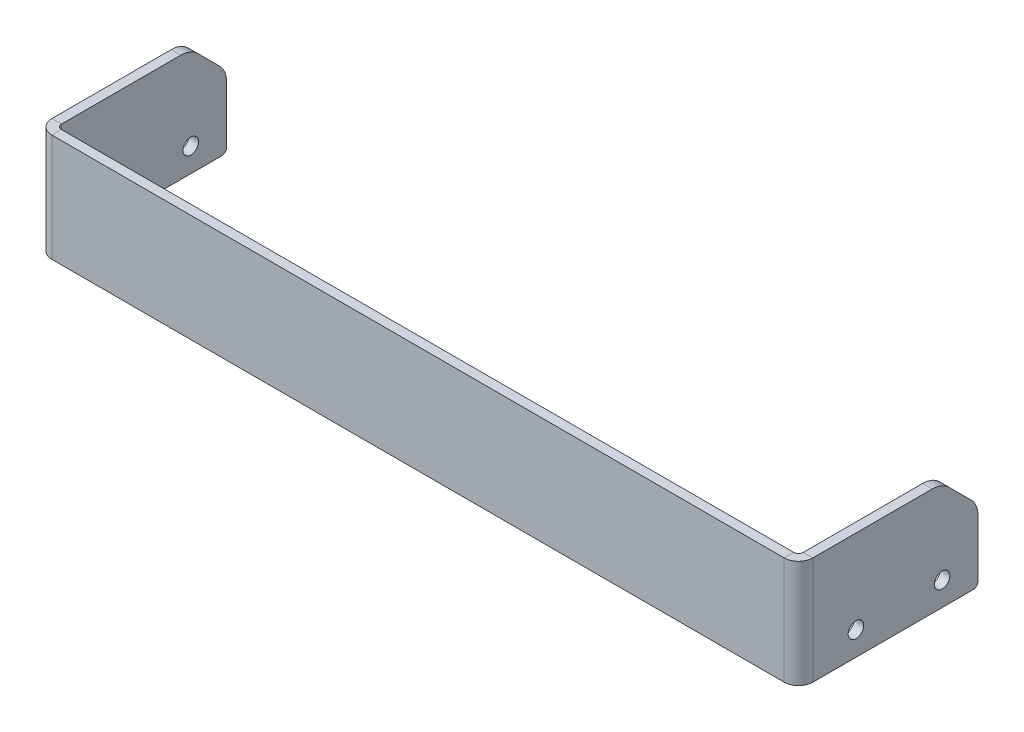
ISO-10303-21;
HEADER;
FILE_DESCRIPTION(('STEP AP214'),'2;1');
FILE_NAME('part.step','',(''),(''),'','','');
FILE_SCHEMA(('AUTOMOTIVE_DESIGN { 1 0 10303 214 1 1 1 1 }'));
ENDSEC;
DATA;
#1=APPLICATION_CONTEXT('core data for automotive mechanical design processes');
#2=APPLICATION_PROTOCOL_DEFINITION('international standard','automotive_design',2000,#1);
#3=PRODUCT_CONTEXT('',#1,'mechanical');
#4=PRODUCT('Part','Part','',(#3));
#5=PRODUCT_RELATED_PRODUCT_CATEGORY('part','',(#4));
#6=PRODUCT_DEFINITION_FORMATION('','',#4);
#7=PRODUCT_DEFINITION_CONTEXT('part definition',#1,'design');
#8=PRODUCT_DEFINITION('design','',#6,#7);
#9=PRODUCT_DEFINITION_SHAPE('','',#8);
#10=(LENGTH_UNIT() NAMED_UNIT(*) SI_UNIT(.MILLI.,.METRE.));
#11=(NAMED_UNIT(*) PLANE_ANGLE_UNIT() SI_UNIT($,.RADIAN.));
#12=(NAMED_UNIT(*) SI_UNIT($,.STERADIAN.) SOLID_ANGLE_UNIT());
#13=UNCERTAINTY_MEASURE_WITH_UNIT(LENGTH_MEASURE(1.E-05),#10,'distance_accuracy_value','');
#14=(GEOMETRIC_REPRESENTATION_CONTEXT(3) GLOBAL_UNCERTAINTY_ASSIGNED_CONTEXT((#13)) GLOBAL_UNIT_ASSIGNED_CONTEXT((#10,
#11,#12)) REPRESENTATION_CONTEXT('',''));
#15=CARTESIAN_POINT('',(0.,0.,0.));
#16=DIRECTION('',(0.,0.,1.));
#17=DIRECTION('',(1.,0.,0.));
#18=AXIS2_PLACEMENT_3D('',#15,#16,#17);
#19=CARTESIAN_POINT('',(-159.,0.,-4.));
#20=DIRECTION('',(0.,1.,0.));
#21=DIRECTION('',(1.,0.,0.));
#22=AXIS2_PLACEMENT_3D('',#19,#20,#21);
#23=PLANE('',#22);
#24=DIRECTION('',(0.,0.,-1.));
#25=VECTOR('',#24,1.);
#26=CARTESIAN_POINT('',(153.,0.,-4.));
#27=LINE('',#26,#25);
#28=CARTESIAN_POINT('',(153.,0.,0.));
#29=VERTEX_POINT('',#28);
#30=CARTESIAN_POINT('',(153.,0.,-4.));
#31=VERTEX_POINT('',#30);
#32=EDGE_CURVE('E177',#29,#31,#27,.T.);
#33=ORIENTED_EDGE('',*,*,#32,.F.);
#34=DIRECTION('',(-1.,0.,0.));
#35=VECTOR('',#34,1.);
#36=CARTESIAN_POINT('',(-159.,0.,0.));
#37=LINE('',#36,#35);
#38=CARTESIAN_POINT('',(-153.,0.,0.));
#39=VERTEX_POINT('',#38);
#40=EDGE_CURVE('E265',#39,#29,#37,.F.);
#41=ORIENTED_EDGE('',*,*,#40,.F.);
#42=DIRECTION('',(0.,0.,-1.));
#43=VECTOR('',#42,1.);
#44=CARTESIAN_POINT('',(-153.,0.,-4.));
#45=LINE('',#44,#43);
#46=CARTESIAN_POINT('',(-153.,0.,-4.));
#47=VERTEX_POINT('',#46);
#48=EDGE_CURVE('E189',#39,#47,#45,.T.);
#49=ORIENTED_EDGE('',*,*,#48,.T.);
#50=DIRECTION('',(1.,0.,0.));
#51=VECTOR('',#50,1.);
#52=CARTESIAN_POINT('',(-159.,0.,-4.));
#53=LINE('',#52,#51);
#54=EDGE_CURVE('E204',#47,#31,#53,.T.);
#55=ORIENTED_EDGE('',*,*,#54,.T.);
#56=EDGE_LOOP('',(#33,#41,#49,#55));
#57=FACE_BOUND('',#56,.T.);
#58=ADVANCED_FACE('F40',(#57),#23,.F.);
#59=CARTESIAN_POINT('',(-153.,0.,-6.00000000000002));
#60=DIRECTION('',(0.,1.,0.));
#61=DIRECTION('',(0.,0.,1.));
#62=AXIS2_PLACEMENT_3D('',#59,#60,#61);
#63=PLANE('',#62);
#64=ORIENTED_EDGE('',*,*,#48,.F.);
#65=CARTESIAN_POINT('',(-153.,0.,-6.00000000000002));
#66=DIRECTION('',(0.,1.,0.));
#67=DIRECTION('',(0.,0.,1.));
#68=AXIS2_PLACEMENT_3D('',#65,#66,#67);
#69=CIRCLE('',#68,6.);
#70=CARTESIAN_POINT('',(-159.,0.,-6.00000000000002));
#71=VERTEX_POINT('',#70);
#72=EDGE_CURVE('E269',#39,#71,#69,.F.);
#73=ORIENTED_EDGE('',*,*,#72,.T.);
#74=DIRECTION('',(1.,0.,0.));
#75=VECTOR('',#74,1.);
#76=CARTESIAN_POINT('',(-155.,0.,-6.00000000000002));
#77=LINE('',#76,#75);
#78=CARTESIAN_POINT('',(-155.,0.,-6.00000000000002));
#79=VERTEX_POINT('',#78);
#80=EDGE_CURVE('E292',#71,#79,#77,.T.);
#81=ORIENTED_EDGE('',*,*,#80,.T.);
#82=CARTESIAN_POINT('',(-153.,0.,-6.00000000000002));
#83=DIRECTION('',(0.,-1.,0.));
#84=DIRECTION('',(0.,0.,-1.));
#85=AXIS2_PLACEMENT_3D('',#82,#83,#84);
#86=CIRCLE('',#85,2.);
#87=EDGE_CURVE('E231',#47,#79,#86,.T.);
#88=ORIENTED_EDGE('',*,*,#87,.F.);
#89=EDGE_LOOP('',(#64,#73,#81,#88));
#90=FACE_BOUND('',#89,.T.);
#91=ADVANCED_FACE('F426',(#90),#63,.F.);
#92=CARTESIAN_POINT('',(-155.,0.,-75.));
#93=DIRECTION('',(0.,-1.,0.));
#94=DIRECTION('',(0.,0.,-1.));
#95=AXIS2_PLACEMENT_3D('',#92,#93,#94);
#96=PLANE('',#95);
#97=DIRECTION('',(0.,0.,-1.));
#98=VECTOR('',#97,1.);
#99=CARTESIAN_POINT('',(-159.,0.,-75.));
#100=LINE('',#99,#98);
#101=CARTESIAN_POINT('',(-159.,0.,-73.));
#102=VERTEX_POINT('',#101);
#103=EDGE_CURVE('E272',#102,#71,#100,.F.);
#104=ORIENTED_EDGE('',*,*,#103,.F.);
#105=DIRECTION('',(-1.,0.,0.));
#106=VECTOR('',#105,1.);
#107=CARTESIAN_POINT('',(-155.,0.,-73.));
#108=LINE('',#107,#106);
#109=CARTESIAN_POINT('',(-155.,0.,-73.));
#110=VERTEX_POINT('',#109);
#111=EDGE_CURVE('E188',#102,#110,#108,.F.);
#112=ORIENTED_EDGE('',*,*,#111,.T.);
#113=DIRECTION('',(0.,0.,-1.));
#114=VECTOR('',#113,1.);
#115=CARTESIAN_POINT('',(-155.,0.,-75.));
#116=LINE('',#115,#114);
#117=EDGE_CURVE('E209',#110,#79,#116,.F.);
#118=ORIENTED_EDGE('',*,*,#117,.T.);
#119=ORIENTED_EDGE('',*,*,#80,.F.);
#120=EDGE_LOOP('',(#104,#112,#118,#119));
#121=FACE_BOUND('',#120,.T.);
#122=ADVANCED_FACE('F432',(#121),#96,.T.);
#123=CARTESIAN_POINT('',(-155.,45.,-75.));
#124=DIRECTION('',(0.,0.,1.));
#125=DIRECTION('',(0.,-1.,0.));
#126=AXIS2_PLACEMENT_3D('',#123,#124,#125);
#127=PLANE('',#126);
#128=DIRECTION('',(0.,1.,0.));
#129=VECTOR('',#128,1.);
#130=CARTESIAN_POINT('',(-159.,45.,-75.));
#131=LINE('',#130,#129);
#132=CARTESIAN_POINT('',(-159.,25.857864376269,-75.));
#133=VERTEX_POINT('',#132);
#134=CARTESIAN_POINT('',(-159.,2.00000000000002,-75.));
#135=VERTEX_POINT('',#134);
#136=EDGE_CURVE('E262',#133,#135,#131,.F.);
#137=ORIENTED_EDGE('',*,*,#136,.F.);
#138=DIRECTION('',(1.,0.,0.));
#139=VECTOR('',#138,1.);
#140=CARTESIAN_POINT('',(-155.,25.857864376269,-75.));
#141=LINE('',#140,#139);
#142=CARTESIAN_POINT('',(-155.,25.857864376269,-75.));
#143=VERTEX_POINT('',#142);
#144=EDGE_CURVE('E335',#133,#143,#141,.T.);
#145=ORIENTED_EDGE('',*,*,#144,.T.);
#146=DIRECTION('',(0.,-1.,0.));
#147=VECTOR('',#146,1.);
#148=CARTESIAN_POINT('',(-155.,45.,-75.));
#149=LINE('',#148,#147);
#150=CARTESIAN_POINT('',(-155.,2.00000000000002,-75.));
#151=VERTEX_POINT('',#150);
#152=EDGE_CURVE('E225',#143,#151,#149,.T.);
#153=ORIENTED_EDGE('',*,*,#152,.T.);
#154=DIRECTION('',(1.,0.,0.));
#155=VECTOR('',#154,1.);
#156=CARTESIAN_POINT('',(-155.,2.,-75.));
#157=LINE('',#156,#155);
#158=EDGE_CURVE('E302',#151,#135,#157,.F.);
#159=ORIENTED_EDGE('',*,*,#158,.T.);
#160=EDGE_LOOP('',(#137,#145,#153,#159));
#161=FACE_BOUND('',#160,.T.);
#162=ADVANCED_FACE('F354',(#161),#127,.F.);
#163=CARTESIAN_POINT('',(-155.,37.5,-67.5));
#164=DIRECTION('',(0.,0.707106781186549,-0.707106781186545));
#165=DIRECTION('',(0.,0.707106781186545,0.707106781186549));
#166=AXIS2_PLACEMENT_3D('',#163,#164,#165);
#167=PLANE('',#166);
#168=DIRECTION('',(0.,0.707106781186545,0.707106781186549));
#169=VECTOR('',#168,1.);
#170=CARTESIAN_POINT('',(-155.,37.5,-67.5));
#171=LINE('',#170,#169);
#172=CARTESIAN_POINT('',(-155.,32.9289321881345,-72.0710678118654));
#173=VERTEX_POINT('',#172);
#174=CARTESIAN_POINT('',(-155.,42.0710678118655,-62.9289321881344));
#175=VERTEX_POINT('',#174);
#176=EDGE_CURVE('E363',#173,#175,#171,.T.);
#177=ORIENTED_EDGE('',*,*,#176,.F.);
#178=DIRECTION('',(-1.,0.,0.));
#179=VECTOR('',#178,1.);
#180=CARTESIAN_POINT('',(-155.,32.9289321881345,-72.0710678118654));
#181=LINE('',#180,#179);
#182=CARTESIAN_POINT('',(-159.,32.9289321881345,-72.0710678118654));
#183=VERTEX_POINT('',#182);
#184=EDGE_CURVE('E345',#173,#183,#181,.T.);
#185=ORIENTED_EDGE('',*,*,#184,.T.);
#186=DIRECTION('',(0.,0.707106781186545,0.707106781186549));
#187=VECTOR('',#186,1.);
#188=CARTESIAN_POINT('',(-159.,37.5,-67.5));
#189=LINE('',#188,#187);
#190=CARTESIAN_POINT('',(-159.,42.0710678118655,-62.9289321881344));
#191=VERTEX_POINT('',#190);
#192=EDGE_CURVE('E273',#183,#191,#189,.T.);
#193=ORIENTED_EDGE('',*,*,#192,.T.);
#194=DIRECTION('',(-1.,0.,0.));
#195=VECTOR('',#194,1.);
#196=CARTESIAN_POINT('',(-155.,42.0710678118655,-62.9289321881344));
#197=LINE('',#196,#195);
#198=EDGE_CURVE('E342',#191,#175,#197,.F.);
#199=ORIENTED_EDGE('',*,*,#198,.T.);
#200=EDGE_LOOP('',(#177,#185,#193,#199));
#201=FACE_BOUND('',#200,.T.);
#202=ADVANCED_FACE('F365',(#201),#167,.T.);
#203=CARTESIAN_POINT('',(-155.,45.,-75.));
#204=DIRECTION('',(0.,-1.,0.));
#205=DIRECTION('',(0.,0.,-1.));
#206=AXIS2_PLACEMENT_3D('',#203,#204,#205);
#207=PLANE('',#206);
#208=DIRECTION('',(0.,0.,-1.));
#209=VECTOR('',#208,1.);
#210=CARTESIAN_POINT('',(-155.,45.,-75.));
#211=LINE('',#210,#209);
#212=CARTESIAN_POINT('',(-155.,45.,-55.857864376269));
#213=VERTEX_POINT('',#212);
#214=CARTESIAN_POINT('',(-155.,45.,-6.00000000000002));
#215=VERTEX_POINT('',#214);
#216=EDGE_CURVE('E367',#213,#215,#211,.F.);
#217=ORIENTED_EDGE('',*,*,#216,.F.);
#218=DIRECTION('',(1.,0.,0.));
#219=VECTOR('',#218,1.);
#220=CARTESIAN_POINT('',(-155.,45.,-55.857864376269));
#221=LINE('',#220,#219);
#222=CARTESIAN_POINT('',(-159.,45.,-55.857864376269));
#223=VERTEX_POINT('',#222);
#224=EDGE_CURVE('E11',#213,#223,#221,.F.);
#225=ORIENTED_EDGE('',*,*,#224,.T.);
#226=DIRECTION('',(0.,0.,-1.));
#227=VECTOR('',#226,1.);
#228=CARTESIAN_POINT('',(-159.,45.,-75.));
#229=LINE('',#228,#227);
#230=CARTESIAN_POINT('',(-159.,45.,-6.00000000000002));
#231=VERTEX_POINT('',#230);
#232=EDGE_CURVE('E270',#223,#231,#229,.F.);
#233=ORIENTED_EDGE('',*,*,#232,.T.);
#234=DIRECTION('',(1.,0.,0.));
#235=VECTOR('',#234,1.);
#236=CARTESIAN_POINT('',(-155.,45.,-6.00000000000002));
#237=LINE('',#236,#235);
#238=EDGE_CURVE('E289',#231,#215,#237,.T.);
#239=ORIENTED_EDGE('',*,*,#238,.T.);
#240=EDGE_LOOP('',(#217,#225,#233,#239));
#241=FACE_BOUND('',#240,.T.);
#242=ADVANCED_FACE('F469',(#241),#207,.F.);
#243=CARTESIAN_POINT('',(-153.,45.,-6.00000000000002));
#244=DIRECTION('',(0.,-1.,0.));
#245=DIRECTION('',(0.,0.,-1.));
#246=AXIS2_PLACEMENT_3D('',#243,#244,#245);
#247=PLANE('',#246);
#248=ORIENTED_EDGE('',*,*,#238,.F.);
#249=CARTESIAN_POINT('',(-153.,45.,-6.00000000000002));
#250=DIRECTION('',(0.,1.,0.));
#251=DIRECTION('',(0.,0.,1.));
#252=AXIS2_PLACEMENT_3D('',#249,#250,#251);
#253=CIRCLE('',#252,6.);
#254=CARTESIAN_POINT('',(-153.,45.,0.));
#255=VERTEX_POINT('',#254);
#256=EDGE_CURVE('E266',#231,#255,#253,.T.);
#257=ORIENTED_EDGE('',*,*,#256,.T.);
#258=DIRECTION('',(0.,0.,-1.));
#259=VECTOR('',#258,1.);
#260=CARTESIAN_POINT('',(-153.,45.,-4.));
#261=LINE('',#260,#259);
#262=CARTESIAN_POINT('',(-153.,45.,-4.));
#263=VERTEX_POINT('',#262);
#264=EDGE_CURVE('E287',#255,#263,#261,.T.);
#265=ORIENTED_EDGE('',*,*,#264,.T.);
#266=CARTESIAN_POINT('',(-153.,45.,-6.00000000000002));
#267=DIRECTION('',(0.,1.,0.));
#268=DIRECTION('',(0.,0.,1.));
#269=AXIS2_PLACEMENT_3D('',#266,#267,#268);
#270=CIRCLE('',#269,2.);
#271=EDGE_CURVE('E201',#215,#263,#270,.T.);
#272=ORIENTED_EDGE('',*,*,#271,.F.);
#273=EDGE_LOOP('',(#248,#257,#265,#272));
#274=FACE_BOUND('',#273,.T.);
#275=ADVANCED_FACE('F466',(#274),#247,.F.);
#276=CARTESIAN_POINT('',(-159.,45.,-4.));
#277=DIRECTION('',(0.,1.,0.));
#278=DIRECTION('',(1.,0.,0.));
#279=AXIS2_PLACEMENT_3D('',#276,#277,#278);
#280=PLANE('',#279);
#281=ORIENTED_EDGE('',*,*,#264,.F.);
#282=DIRECTION('',(-1.,0.,0.));
#283=VECTOR('',#282,1.);
#284=CARTESIAN_POINT('',(-159.,45.,0.));
#285=LINE('',#284,#283);
#286=CARTESIAN_POINT('',(153.,45.,0.));
#287=VERTEX_POINT('',#286);
#288=EDGE_CURVE('E258',#255,#287,#285,.F.);
#289=ORIENTED_EDGE('',*,*,#288,.T.);
#290=DIRECTION('',(0.,0.,-1.));
#291=VECTOR('',#290,1.);
#292=CARTESIAN_POINT('',(153.,45.,-4.));
#293=LINE('',#292,#291);
#294=CARTESIAN_POINT('',(153.,45.,-4.));
#295=VERTEX_POINT('',#294);
#296=EDGE_CURVE('E285',#287,#295,#293,.T.);
#297=ORIENTED_EDGE('',*,*,#296,.T.);
#298=DIRECTION('',(1.,0.,0.));
#299=VECTOR('',#298,1.);
#300=CARTESIAN_POINT('',(-159.,45.,-4.));
#301=LINE('',#300,#299);
#302=EDGE_CURVE('E208',#263,#295,#301,.T.);
#303=ORIENTED_EDGE('',*,*,#302,.F.);
#304=EDGE_LOOP('',(#281,#289,#297,#303));
#305=FACE_BOUND('',#304,.T.);
#306=ADVANCED_FACE('F473',(#305),#280,.T.);
#307=CARTESIAN_POINT('',(153.,45.,-6.));
#308=DIRECTION('',(0.,1.,0.));
#309=DIRECTION('',(0.,0.,1.));
#310=AXIS2_PLACEMENT_3D('',#307,#308,#309);
#311=PLANE('',#310);
#312=ORIENTED_EDGE('',*,*,#296,.F.);
#313=CARTESIAN_POINT('',(153.,45.,-6.));
#314=DIRECTION('',(0.,1.,0.));
#315=DIRECTION('',(0.,0.,1.));
#316=AXIS2_PLACEMENT_3D('',#313,#314,#315);
#317=CIRCLE('',#316,6.);
#318=CARTESIAN_POINT('',(159.,45.,-6.));
#319=VERTEX_POINT('',#318);
#320=EDGE_CURVE('E259',#287,#319,#317,.T.);
#321=ORIENTED_EDGE('',*,*,#320,.T.);
#322=DIRECTION('',(-1.,0.,0.));
#323=VECTOR('',#322,1.);
#324=CARTESIAN_POINT('',(155.,45.,-6.));
#325=LINE('',#324,#323);
#326=CARTESIAN_POINT('',(155.,45.,-6.));
#327=VERTEX_POINT('',#326);
#328=EDGE_CURVE('E283',#319,#327,#325,.T.);
#329=ORIENTED_EDGE('',*,*,#328,.T.);
#330=CARTESIAN_POINT('',(153.,45.,-6.));
#331=DIRECTION('',(0.,-1.,0.));
#332=DIRECTION('',(0.,0.,-1.));
#333=AXIS2_PLACEMENT_3D('',#330,#331,#332);
#334=CIRCLE('',#333,2.);
#335=EDGE_CURVE('E200',#295,#327,#334,.F.);
#336=ORIENTED_EDGE('',*,*,#335,.F.);
#337=EDGE_LOOP('',(#312,#321,#329,#336));
#338=FACE_BOUND('',#337,.T.);
#339=ADVANCED_FACE('F475',(#338),#311,.T.);
#340=CARTESIAN_POINT('',(155.,45.,0.));
#341=DIRECTION('',(0.,1.,0.));
#342=DIRECTION('',(0.,0.,-1.));
#343=AXIS2_PLACEMENT_3D('',#340,#341,#342);
#344=PLANE('',#343);
#345=DIRECTION('',(0.,0.,1.));
#346=VECTOR('',#345,1.);
#347=CARTESIAN_POINT('',(159.,45.,0.));
#348=LINE('',#347,#346);
#349=CARTESIAN_POINT('',(159.,45.,-55.857864376269));
#350=VERTEX_POINT('',#349);
#351=EDGE_CURVE('E255',#319,#350,#348,.F.);
#352=ORIENTED_EDGE('',*,*,#351,.T.);
#353=DIRECTION('',(-1.,0.,0.));
#354=VECTOR('',#353,1.);
#355=CARTESIAN_POINT('',(155.,45.,-55.857864376269));
#356=LINE('',#355,#354);
#357=CARTESIAN_POINT('',(155.,45.,-55.857864376269));
#358=VERTEX_POINT('',#357);
#359=EDGE_CURVE('E332',#350,#358,#356,.T.);
#360=ORIENTED_EDGE('',*,*,#359,.T.);
#361=DIRECTION('',(0.,0.,-1.));
#362=VECTOR('',#361,1.);
#363=CARTESIAN_POINT('',(155.,45.,0.));
#364=LINE('',#363,#362);
#365=EDGE_CURVE('E375',#327,#358,#364,.T.);
#366=ORIENTED_EDGE('',*,*,#365,.F.);
#367=ORIENTED_EDGE('',*,*,#328,.F.);
#368=EDGE_LOOP('',(#352,#360,#366,#367));
#369=FACE_BOUND('',#368,.T.);
#370=ADVANCED_FACE('F404',(#369),#344,.T.);
#371=CARTESIAN_POINT('',(155.,75.,-29.9999999999998));
#372=DIRECTION('',(0.,0.707106781186549,-0.707106781186545));
#373=DIRECTION('',(0.,-0.707106781186545,-0.707106781186549));
#374=AXIS2_PLACEMENT_3D('',#371,#372,#373);
#375=PLANE('',#374);
#376=DIRECTION('',(0.,-0.707106781186545,-0.707106781186549));
#377=VECTOR('',#376,1.);
#378=CARTESIAN_POINT('',(159.,75.,-29.9999999999998));
#379=LINE('',#378,#377);
#380=CARTESIAN_POINT('',(159.,42.0710678118655,-62.9289321881345));
#381=VERTEX_POINT('',#380);
#382=CARTESIAN_POINT('',(159.,32.9289321881346,-72.0710678118654));
#383=VERTEX_POINT('',#382);
#384=EDGE_CURVE('E252',#381,#383,#379,.T.);
#385=ORIENTED_EDGE('',*,*,#384,.T.);
#386=DIRECTION('',(-1.,0.,0.));
#387=VECTOR('',#386,1.);
#388=CARTESIAN_POINT('',(155.,32.9289321881346,-72.0710678118654));
#389=LINE('',#388,#387);
#390=CARTESIAN_POINT('',(155.,32.9289321881346,-72.0710678118654));
#391=VERTEX_POINT('',#390);
#392=EDGE_CURVE('E319',#383,#391,#389,.T.);
#393=ORIENTED_EDGE('',*,*,#392,.T.);
#394=DIRECTION('',(0.,-0.707106781186545,-0.707106781186549));
#395=VECTOR('',#394,1.);
#396=CARTESIAN_POINT('',(155.,75.,-29.9999999999998));
#397=LINE('',#396,#395);
#398=CARTESIAN_POINT('',(155.,42.0710678118655,-62.9289321881345));
#399=VERTEX_POINT('',#398);
#400=EDGE_CURVE('E378',#399,#391,#397,.T.);
#401=ORIENTED_EDGE('',*,*,#400,.F.);
#402=DIRECTION('',(-1.,0.,0.));
#403=VECTOR('',#402,1.);
#404=CARTESIAN_POINT('',(155.,42.0710678118655,-62.9289321881345));
#405=LINE('',#404,#403);
#406=EDGE_CURVE('E317',#399,#381,#405,.F.);
#407=ORIENTED_EDGE('',*,*,#406,.T.);
#408=EDGE_LOOP('',(#385,#393,#401,#407));
#409=FACE_BOUND('',#408,.T.);
#410=ADVANCED_FACE('F412',(#409),#375,.T.);
#411=CARTESIAN_POINT('',(155.,45.,-75.));
#412=DIRECTION('',(0.,0.,-1.));
#413=DIRECTION('',(0.,-1.,0.));
#414=AXIS2_PLACEMENT_3D('',#411,#412,#413);
#415=PLANE('',#414);
#416=DIRECTION('',(0.,-1.,0.));
#417=VECTOR('',#416,1.);
#418=CARTESIAN_POINT('',(155.,45.,-75.));
#419=LINE('',#418,#417);
#420=CARTESIAN_POINT('',(155.,25.8578643762691,-75.));
#421=VERTEX_POINT('',#420);
#422=CARTESIAN_POINT('',(155.,2.00000000000002,-75.));
#423=VERTEX_POINT('',#422);
#424=EDGE_CURVE('E220',#421,#423,#419,.T.);
#425=ORIENTED_EDGE('',*,*,#424,.F.);
#426=DIRECTION('',(-1.,0.,0.));
#427=VECTOR('',#426,1.);
#428=CARTESIAN_POINT('',(155.,25.8578643762691,-75.));
#429=LINE('',#428,#427);
#430=CARTESIAN_POINT('',(159.,25.8578643762691,-75.));
#431=VERTEX_POINT('',#430);
#432=EDGE_CURVE('E326',#421,#431,#429,.F.);
#433=ORIENTED_EDGE('',*,*,#432,.T.);
#434=DIRECTION('',(0.,1.,0.));
#435=VECTOR('',#434,1.);
#436=CARTESIAN_POINT('',(159.,45.,-75.));
#437=LINE('',#436,#435);
#438=CARTESIAN_POINT('',(159.,2.00000000000002,-75.));
#439=VERTEX_POINT('',#438);
#440=EDGE_CURVE('E250',#431,#439,#437,.F.);
#441=ORIENTED_EDGE('',*,*,#440,.T.);
#442=DIRECTION('',(1.,0.,0.));
#443=VECTOR('',#442,1.);
#444=CARTESIAN_POINT('',(155.,2.,-75.));
#445=LINE('',#444,#443);
#446=EDGE_CURVE('E307',#439,#423,#445,.F.);
#447=ORIENTED_EDGE('',*,*,#446,.T.);
#448=EDGE_LOOP('',(#425,#433,#441,#447));
#449=FACE_BOUND('',#448,.T.);
#450=ADVANCED_FACE('F391',(#449),#415,.T.);
#451=CARTESIAN_POINT('',(155.,0.,0.));
#452=DIRECTION('',(0.,1.,0.));
#453=DIRECTION('',(0.,0.,-1.));
#454=AXIS2_PLACEMENT_3D('',#451,#452,#453);
#455=PLANE('',#454);
#456=DIRECTION('',(0.,0.,-1.));
#457=VECTOR('',#456,1.);
#458=CARTESIAN_POINT('',(155.,0.,0.));
#459=LINE('',#458,#457);
#460=CARTESIAN_POINT('',(155.,0.,-6.));
#461=VERTEX_POINT('',#460);
#462=CARTESIAN_POINT('',(155.,0.,-73.));
#463=VERTEX_POINT('',#462);
#464=EDGE_CURVE('E215',#461,#463,#459,.T.);
#465=ORIENTED_EDGE('',*,*,#464,.T.);
#466=DIRECTION('',(-1.,0.,0.));
#467=VECTOR('',#466,1.);
#468=CARTESIAN_POINT('',(155.,0.,-73.));
#469=LINE('',#468,#467);
#470=CARTESIAN_POINT('',(159.,0.,-73.));
#471=VERTEX_POINT('',#470);
#472=EDGE_CURVE('E312',#463,#471,#469,.F.);
#473=ORIENTED_EDGE('',*,*,#472,.T.);
#474=DIRECTION('',(0.,0.,1.));
#475=VECTOR('',#474,1.);
#476=CARTESIAN_POINT('',(159.,0.,0.));
#477=LINE('',#476,#475);
#478=CARTESIAN_POINT('',(159.,0.,-6.));
#479=VERTEX_POINT('',#478);
#480=EDGE_CURVE('E243',#479,#471,#477,.F.);
#481=ORIENTED_EDGE('',*,*,#480,.F.);
#482=DIRECTION('',(-1.,0.,0.));
#483=VECTOR('',#482,1.);
#484=CARTESIAN_POINT('',(155.,0.,-6.));
#485=LINE('',#484,#483);
#486=EDGE_CURVE('E230',#479,#461,#485,.T.);
#487=ORIENTED_EDGE('',*,*,#486,.T.);
#488=EDGE_LOOP('',(#465,#473,#481,#487));
#489=FACE_BOUND('',#488,.T.);
#490=ADVANCED_FACE('F400',(#489),#455,.F.);
#491=CARTESIAN_POINT('',(153.,0.,-6.));
#492=DIRECTION('',(0.,-1.,0.));
#493=DIRECTION('',(0.,0.,-1.));
#494=AXIS2_PLACEMENT_3D('',#491,#492,#493);
#495=PLANE('',#494);
#496=CARTESIAN_POINT('',(153.,0.,-6.));
#497=DIRECTION('',(0.,1.,0.));
#498=DIRECTION('',(0.,0.,1.));
#499=AXIS2_PLACEMENT_3D('',#496,#497,#498);
#500=CIRCLE('',#499,6.);
#501=EDGE_CURVE('E183',#479,#29,#500,.F.);
#502=ORIENTED_EDGE('',*,*,#501,.T.);
#503=ORIENTED_EDGE('',*,*,#32,.T.);
#504=CARTESIAN_POINT('',(153.,0.,-6.));
#505=DIRECTION('',(0.,1.,0.));
#506=DIRECTION('',(0.,0.,1.));
#507=AXIS2_PLACEMENT_3D('',#504,#505,#506);
#508=CIRCLE('',#507,2.);
#509=EDGE_CURVE('E180',#461,#31,#508,.F.);
#510=ORIENTED_EDGE('',*,*,#509,.F.);
#511=ORIENTED_EDGE('',*,*,#486,.F.);
#512=EDGE_LOOP('',(#502,#503,#510,#511));
#513=FACE_BOUND('',#512,.T.);
#514=ADVANCED_FACE('F179',(#513),#495,.T.);
#515=CARTESIAN_POINT('',(155.,45.,0.));
#516=DIRECTION('',(-1.,0.,0.));
#517=DIRECTION('',(0.,0.,1.));
#518=AXIS2_PLACEMENT_3D('',#515,#516,#517);
#519=PLANE('',#518);
#520=CARTESIAN_POINT('',(155.,10.,-60.));
#521=DIRECTION('',(-1.,0.,0.));
#522=DIRECTION('',(0.,0.,1.));
#523=AXIS2_PLACEMENT_3D('',#520,#521,#522);
#524=CIRCLE('',#523,3.24999999999994);
#525=CARTESIAN_POINT('',(155.,10.,-56.7500000000001));
#526=VERTEX_POINT('',#525);
#527=EDGE_CURVE('E813',#526,#526,#524,.T.);
#528=ORIENTED_EDGE('',*,*,#527,.F.);
#529=EDGE_LOOP('',(#528));
#530=FACE_BOUND('',#529,.T.);
#531=CARTESIAN_POINT('',(155.,10.,-24.));
#532=DIRECTION('',(-1.,0.,0.));
#533=DIRECTION('',(0.,0.,1.));
#534=AXIS2_PLACEMENT_3D('',#531,#532,#533);
#535=CIRCLE('',#534,3.24999999999994);
#536=CARTESIAN_POINT('',(155.,10.,-20.7500000000001));
#537=VERTEX_POINT('',#536);
#538=EDGE_CURVE('E279',#537,#537,#535,.T.);
#539=ORIENTED_EDGE('',*,*,#538,.F.);
#540=EDGE_LOOP('',(#539));
#541=FACE_BOUND('',#540,.T.);
#542=ORIENTED_EDGE('',*,*,#400,.T.);
#543=CARTESIAN_POINT('',(155.,25.8578643762691,-65.));
#544=DIRECTION('',(-1.,0.,0.));
#545=DIRECTION('',(0.,0.,1.));
#546=AXIS2_PLACEMENT_3D('',#543,#544,#545);
#547=CIRCLE('',#546,10.);
#548=EDGE_CURVE('E324',#391,#421,#547,.T.);
#549=ORIENTED_EDGE('',*,*,#548,.T.);
#550=ORIENTED_EDGE('',*,*,#424,.T.);
#551=CARTESIAN_POINT('',(155.,2.,-73.));
#552=DIRECTION('',(-1.,0.,0.));
#553=DIRECTION('',(0.,0.,1.));
#554=AXIS2_PLACEMENT_3D('',#551,#552,#553);
#555=CIRCLE('',#554,2.);
#556=EDGE_CURVE('E310',#423,#463,#555,.T.);
#557=ORIENTED_EDGE('',*,*,#556,.T.);
#558=ORIENTED_EDGE('',*,*,#464,.F.);
#559=DIRECTION('',(0.,-1.,0.));
#560=VECTOR('',#559,1.);
#561=CARTESIAN_POINT('',(155.,45.,-6.));
#562=LINE('',#561,#560);
#563=EDGE_CURVE('E199',#461,#327,#562,.F.);
#564=ORIENTED_EDGE('',*,*,#563,.T.);
#565=ORIENTED_EDGE('',*,*,#365,.T.);
#566=CARTESIAN_POINT('',(155.,35.,-55.857864376269));
#567=DIRECTION('',(-1.,0.,0.));
#568=DIRECTION('',(0.,0.,1.));
#569=AXIS2_PLACEMENT_3D('',#566,#567,#568);
#570=CIRCLE('',#569,10.);
#571=EDGE_CURVE('E322',#358,#399,#570,.T.);
#572=ORIENTED_EDGE('',*,*,#571,.T.);
#573=EDGE_LOOP('',(#542,#549,#550,#557,#558,#564,#565,#572));
#574=FACE_BOUND('',#573,.T.);
#575=ADVANCED_FACE('F383',(#530,#541,#574),#519,.T.);
#576=CARTESIAN_POINT('',(-159.,45.,-4.));
#577=DIRECTION('',(0.,0.,-1.));
#578=DIRECTION('',(-1.,0.,0.));
#579=AXIS2_PLACEMENT_3D('',#576,#577,#578);
#580=PLANE('',#579);
#581=ORIENTED_EDGE('',*,*,#54,.F.);
#582=DIRECTION('',(0.,-1.,0.));
#583=VECTOR('',#582,1.);
#584=CARTESIAN_POINT('',(-153.,45.,-4.));
#585=LINE('',#584,#583);
#586=EDGE_CURVE('E228',#47,#263,#585,.F.);
#587=ORIENTED_EDGE('',*,*,#586,.T.);
#588=ORIENTED_EDGE('',*,*,#302,.T.);
#589=DIRECTION('',(0.,-1.,0.));
#590=VECTOR('',#589,1.);
#591=CARTESIAN_POINT('',(153.,0.,-4.));
#592=LINE('',#591,#590);
#593=EDGE_CURVE('E197',#295,#31,#592,.T.);
#594=ORIENTED_EDGE('',*,*,#593,.T.);
#595=EDGE_LOOP('',(#581,#587,#588,#594));
#596=FACE_BOUND('',#595,.T.);
#597=ADVANCED_FACE('F212',(#596),#580,.T.);
#598=CARTESIAN_POINT('',(-155.,45.,-75.));
#599=DIRECTION('',(1.,0.,0.));
#600=DIRECTION('',(0.,0.,-1.));
#601=AXIS2_PLACEMENT_3D('',#598,#599,#600);
#602=PLANE('',#601);
#603=CARTESIAN_POINT('',(-155.,10.,-60.));
#604=DIRECTION('',(1.,0.,0.));
#605=DIRECTION('',(0.,0.,-1.));
#606=AXIS2_PLACEMENT_3D('',#603,#604,#605);
#607=CIRCLE('',#606,3.24999999999994);
#608=CARTESIAN_POINT('',(-155.,10.,-63.2499999999999));
#609=VERTEX_POINT('',#608);
#610=EDGE_CURVE('E819',#609,#609,#607,.T.);
#611=ORIENTED_EDGE('',*,*,#610,.F.);
#612=EDGE_LOOP('',(#611));
#613=FACE_BOUND('',#612,.T.);
#614=CARTESIAN_POINT('',(-155.,10.,-24.));
#615=DIRECTION('',(1.,0.,0.));
#616=DIRECTION('',(0.,0.,-1.));
#617=AXIS2_PLACEMENT_3D('',#614,#615,#616);
#618=CIRCLE('',#617,3.24999999999994);
#619=CARTESIAN_POINT('',(-155.,10.,-27.2499999999999));
#620=VERTEX_POINT('',#619);
#621=EDGE_CURVE('E832',#620,#620,#618,.T.);
#622=ORIENTED_EDGE('',*,*,#621,.F.);
#623=EDGE_LOOP('',(#622));
#624=FACE_BOUND('',#623,.T.);
#625=ORIENTED_EDGE('',*,*,#152,.F.);
#626=CARTESIAN_POINT('',(-155.,25.857864376269,-65.));
#627=DIRECTION('',(1.,0.,0.));
#628=DIRECTION('',(0.,0.,-1.));
#629=AXIS2_PLACEMENT_3D('',#626,#627,#628);
#630=CIRCLE('',#629,10.);
#631=EDGE_CURVE('E340',#143,#173,#630,.T.);
#632=ORIENTED_EDGE('',*,*,#631,.T.);
#633=ORIENTED_EDGE('',*,*,#176,.T.);
#634=CARTESIAN_POINT('',(-155.,35.,-55.857864376269));
#635=DIRECTION('',(1.,0.,0.));
#636=DIRECTION('',(0.,0.,-1.));
#637=AXIS2_PLACEMENT_3D('',#634,#635,#636);
#638=CIRCLE('',#637,10.);
#639=EDGE_CURVE('E338',#175,#213,#638,.T.);
#640=ORIENTED_EDGE('',*,*,#639,.T.);
#641=ORIENTED_EDGE('',*,*,#216,.T.);
#642=DIRECTION('',(0.,-1.,0.));
#643=VECTOR('',#642,1.);
#644=CARTESIAN_POINT('',(-155.,0.,-6.00000000000002));
#645=LINE('',#644,#643);
#646=EDGE_CURVE('E217',#215,#79,#645,.T.);
#647=ORIENTED_EDGE('',*,*,#646,.T.);
#648=ORIENTED_EDGE('',*,*,#117,.F.);
#649=CARTESIAN_POINT('',(-155.,2.,-73.));
#650=DIRECTION('',(1.,0.,0.));
#651=DIRECTION('',(0.,0.,-1.));
#652=AXIS2_PLACEMENT_3D('',#649,#650,#651);
#653=CIRCLE('',#652,2.);
#654=EDGE_CURVE('E299',#110,#151,#653,.T.);
#655=ORIENTED_EDGE('',*,*,#654,.T.);
#656=EDGE_LOOP('',(#625,#632,#633,#640,#641,#647,#648,#655));
#657=FACE_BOUND('',#656,.T.);
#658=ADVANCED_FACE('F362',(#613,#624,#657),#602,.T.);
#659=CARTESIAN_POINT('',(153.,45.,-6.));
#660=DIRECTION('',(0.,1.,0.));
#661=DIRECTION('',(0.,0.,1.));
#662=AXIS2_PLACEMENT_3D('',#659,#660,#661);
#663=CYLINDRICAL_SURFACE('',#662,2.);
#664=ORIENTED_EDGE('',*,*,#335,.T.);
#665=ORIENTED_EDGE('',*,*,#563,.F.);
#666=ORIENTED_EDGE('',*,*,#509,.T.);
#667=ORIENTED_EDGE('',*,*,#593,.F.);
#668=EDGE_LOOP('',(#664,#665,#666,#667));
#669=FACE_BOUND('',#668,.T.);
#670=ADVANCED_FACE('F195',(#669),#663,.F.);
#671=CARTESIAN_POINT('',(-153.,45.,-6.00000000000002));
#672=DIRECTION('',(0.,1.,0.));
#673=DIRECTION('',(0.,0.,1.));
#674=AXIS2_PLACEMENT_3D('',#671,#672,#673);
#675=CYLINDRICAL_SURFACE('',#674,2.);
#676=ORIENTED_EDGE('',*,*,#271,.T.);
#677=ORIENTED_EDGE('',*,*,#586,.F.);
#678=ORIENTED_EDGE('',*,*,#87,.T.);
#679=ORIENTED_EDGE('',*,*,#646,.F.);
#680=EDGE_LOOP('',(#676,#677,#678,#679));
#681=FACE_BOUND('',#680,.T.);
#682=ADVANCED_FACE('F472',(#681),#675,.F.);
#683=CARTESIAN_POINT('',(159.,45.,0.));
#684=DIRECTION('',(-1.,0.,0.));
#685=DIRECTION('',(0.,0.,1.));
#686=AXIS2_PLACEMENT_3D('',#683,#684,#685);
#687=PLANE('',#686);
#688=CARTESIAN_POINT('',(159.,10.,-60.));
#689=DIRECTION('',(-1.,0.,0.));
#690=DIRECTION('',(0.,0.,1.));
#691=AXIS2_PLACEMENT_3D('',#688,#689,#690);
#692=CIRCLE('',#691,3.24999999999992);
#693=CARTESIAN_POINT('',(159.,10.,-56.7500000000001));
#694=VERTEX_POINT('',#693);
#695=EDGE_CURVE('E816',#694,#694,#692,.T.);
#696=ORIENTED_EDGE('',*,*,#695,.T.);
#697=EDGE_LOOP('',(#696));
#698=FACE_BOUND('',#697,.T.);
#699=CARTESIAN_POINT('',(159.,10.,-24.));
#700=DIRECTION('',(-1.,0.,0.));
#701=DIRECTION('',(0.,0.,1.));
#702=AXIS2_PLACEMENT_3D('',#699,#700,#701);
#703=CIRCLE('',#702,3.24999999999992);
#704=CARTESIAN_POINT('',(159.,10.,-20.7500000000001));
#705=VERTEX_POINT('',#704);
#706=EDGE_CURVE('E829',#705,#705,#703,.T.);
#707=ORIENTED_EDGE('',*,*,#706,.T.);
#708=EDGE_LOOP('',(#707));
#709=FACE_BOUND('',#708,.T.);
#710=ORIENTED_EDGE('',*,*,#440,.F.);
#711=CARTESIAN_POINT('',(159.,25.8578643762691,-65.));
#712=DIRECTION('',(-1.,0.,0.));
#713=DIRECTION('',(0.,0.,1.));
#714=AXIS2_PLACEMENT_3D('',#711,#712,#713);
#715=CIRCLE('',#714,10.);
#716=EDGE_CURVE('E330',#431,#383,#715,.F.);
#717=ORIENTED_EDGE('',*,*,#716,.T.);
#718=ORIENTED_EDGE('',*,*,#384,.F.);
#719=CARTESIAN_POINT('',(159.,35.,-55.857864376269));
#720=DIRECTION('',(-1.,0.,0.));
#721=DIRECTION('',(0.,0.,1.));
#722=AXIS2_PLACEMENT_3D('',#719,#720,#721);
#723=CIRCLE('',#722,10.);
#724=EDGE_CURVE('E328',#381,#350,#723,.F.);
#725=ORIENTED_EDGE('',*,*,#724,.T.);
#726=ORIENTED_EDGE('',*,*,#351,.F.);
#727=DIRECTION('',(0.,1.,0.));
#728=VECTOR('',#727,1.);
#729=CARTESIAN_POINT('',(159.,45.,-6.));
#730=LINE('',#729,#728);
#731=EDGE_CURVE('E237',#479,#319,#730,.T.);
#732=ORIENTED_EDGE('',*,*,#731,.F.);
#733=ORIENTED_EDGE('',*,*,#480,.T.);
#734=CARTESIAN_POINT('',(159.,2.,-73.));
#735=DIRECTION('',(-1.,0.,0.));
#736=DIRECTION('',(0.,0.,1.));
#737=AXIS2_PLACEMENT_3D('',#734,#735,#736);
#738=CIRCLE('',#737,2.);
#739=EDGE_CURVE('E314',#471,#439,#738,.F.);
#740=ORIENTED_EDGE('',*,*,#739,.T.);
#741=EDGE_LOOP('',(#710,#717,#718,#725,#726,#732,#733,#740));
#742=FACE_BOUND('',#741,.T.);
#743=ADVANCED_FACE('F395',(#698,#709,#742),#687,.F.);
#744=CARTESIAN_POINT('',(-159.,45.,0.));
#745=DIRECTION('',(0.,0.,-1.));
#746=DIRECTION('',(-1.,0.,0.));
#747=AXIS2_PLACEMENT_3D('',#744,#745,#746);
#748=PLANE('',#747);
#749=ORIENTED_EDGE('',*,*,#40,.T.);
#750=DIRECTION('',(0.,1.,0.));
#751=VECTOR('',#750,1.);
#752=CARTESIAN_POINT('',(153.,45.,0.));
#753=LINE('',#752,#751);
#754=EDGE_CURVE('E241',#287,#29,#753,.F.);
#755=ORIENTED_EDGE('',*,*,#754,.F.);
#756=ORIENTED_EDGE('',*,*,#288,.F.);
#757=DIRECTION('',(0.,1.,0.));
#758=VECTOR('',#757,1.);
#759=CARTESIAN_POINT('',(-153.,45.,0.));
#760=LINE('',#759,#758);
#761=EDGE_CURVE('E234',#39,#255,#760,.T.);
#762=ORIENTED_EDGE('',*,*,#761,.F.);
#763=EDGE_LOOP('',(#749,#755,#756,#762));
#764=FACE_BOUND('',#763,.T.);
#765=ADVANCED_FACE('F460',(#764),#748,.F.);
#766=CARTESIAN_POINT('',(-159.,45.,-75.));
#767=DIRECTION('',(1.,0.,0.));
#768=DIRECTION('',(0.,0.,-1.));
#769=AXIS2_PLACEMENT_3D('',#766,#767,#768);
#770=PLANE('',#769);
#771=CARTESIAN_POINT('',(-159.,10.,-60.));
#772=DIRECTION('',(-1.,0.,0.));
#773=DIRECTION('',(0.,0.,1.));
#774=AXIS2_PLACEMENT_3D('',#771,#772,#773);
#775=CIRCLE('',#774,3.24999999999996);
#776=CARTESIAN_POINT('',(-159.,10.,-56.75));
#777=VERTEX_POINT('',#776);
#778=EDGE_CURVE('E817',#777,#777,#775,.T.);
#779=ORIENTED_EDGE('',*,*,#778,.F.);
#780=EDGE_LOOP('',(#779));
#781=FACE_BOUND('',#780,.T.);
#782=CARTESIAN_POINT('',(-159.,10.,-24.));
#783=DIRECTION('',(-1.,0.,0.));
#784=DIRECTION('',(0.,0.,1.));
#785=AXIS2_PLACEMENT_3D('',#782,#783,#784);
#786=CIRCLE('',#785,3.24999999999996);
#787=CARTESIAN_POINT('',(-159.,10.,-20.75));
#788=VERTEX_POINT('',#787);
#789=EDGE_CURVE('E826',#788,#788,#786,.T.);
#790=ORIENTED_EDGE('',*,*,#789,.F.);
#791=EDGE_LOOP('',(#790));
#792=FACE_BOUND('',#791,.T.);
#793=ORIENTED_EDGE('',*,*,#192,.F.);
#794=CARTESIAN_POINT('',(-159.,25.857864376269,-65.));
#795=DIRECTION('',(1.,0.,0.));
#796=DIRECTION('',(0.,0.,-1.));
#797=AXIS2_PLACEMENT_3D('',#794,#795,#796);
#798=CIRCLE('',#797,10.);
#799=EDGE_CURVE('E48',#183,#133,#798,.F.);
#800=ORIENTED_EDGE('',*,*,#799,.T.);
#801=ORIENTED_EDGE('',*,*,#136,.T.);
#802=CARTESIAN_POINT('',(-159.,2.,-73.));
#803=DIRECTION('',(1.,0.,0.));
#804=DIRECTION('',(0.,0.,-1.));
#805=AXIS2_PLACEMENT_3D('',#802,#803,#804);
#806=CIRCLE('',#805,2.);
#807=EDGE_CURVE('E305',#135,#102,#806,.F.);
#808=ORIENTED_EDGE('',*,*,#807,.T.);
#809=ORIENTED_EDGE('',*,*,#103,.T.);
#810=DIRECTION('',(0.,1.,0.));
#811=VECTOR('',#810,1.);
#812=CARTESIAN_POINT('',(-159.,45.,-6.00000000000002));
#813=LINE('',#812,#811);
#814=EDGE_CURVE('E240',#231,#71,#813,.F.);
#815=ORIENTED_EDGE('',*,*,#814,.F.);
#816=ORIENTED_EDGE('',*,*,#232,.F.);
#817=CARTESIAN_POINT('',(-159.,35.,-55.857864376269));
#818=DIRECTION('',(1.,0.,0.));
#819=DIRECTION('',(0.,0.,-1.));
#820=AXIS2_PLACEMENT_3D('',#817,#818,#819);
#821=CIRCLE('',#820,10.);
#822=EDGE_CURVE('E60',#223,#191,#821,.F.);
#823=ORIENTED_EDGE('',*,*,#822,.T.);
#824=EDGE_LOOP('',(#793,#800,#801,#808,#809,#815,#816,#823));
#825=FACE_BOUND('',#824,.T.);
#826=ADVANCED_FACE('F349',(#781,#792,#825),#770,.F.);
#827=CARTESIAN_POINT('',(153.,45.,-6.));
#828=DIRECTION('',(0.,1.,0.));
#829=DIRECTION('',(0.,0.,1.));
#830=AXIS2_PLACEMENT_3D('',#827,#828,#829);
#831=CYLINDRICAL_SURFACE('',#830,6.);
#832=ORIENTED_EDGE('',*,*,#320,.F.);
#833=ORIENTED_EDGE('',*,*,#754,.T.);
#834=ORIENTED_EDGE('',*,*,#501,.F.);
#835=ORIENTED_EDGE('',*,*,#731,.T.);
#836=EDGE_LOOP('',(#832,#833,#834,#835));
#837=FACE_BOUND('',#836,.T.);
#838=ADVANCED_FACE('F445',(#837),#831,.T.);
#839=CARTESIAN_POINT('',(-153.,45.,-6.00000000000002));
#840=DIRECTION('',(0.,1.,0.));
#841=DIRECTION('',(0.,0.,1.));
#842=AXIS2_PLACEMENT_3D('',#839,#840,#841);
#843=CYLINDRICAL_SURFACE('',#842,6.);
#844=ORIENTED_EDGE('',*,*,#256,.F.);
#845=ORIENTED_EDGE('',*,*,#814,.T.);
#846=ORIENTED_EDGE('',*,*,#72,.F.);
#847=ORIENTED_EDGE('',*,*,#761,.T.);
#848=EDGE_LOOP('',(#844,#845,#846,#847));
#849=FACE_BOUND('',#848,.T.);
#850=ADVANCED_FACE('F440',(#849),#843,.T.);
#851=CARTESIAN_POINT('',(-155.,2.,-73.));
#852=DIRECTION('',(-1.,0.,0.));
#853=DIRECTION('',(0.,0.,1.));
#854=AXIS2_PLACEMENT_3D('',#851,#852,#853);
#855=CYLINDRICAL_SURFACE('',#854,2.);
#856=ORIENTED_EDGE('',*,*,#807,.F.);
#857=ORIENTED_EDGE('',*,*,#158,.F.);
#858=ORIENTED_EDGE('',*,*,#654,.F.);
#859=ORIENTED_EDGE('',*,*,#111,.F.);
#860=EDGE_LOOP('',(#856,#857,#858,#859));
#861=FACE_BOUND('',#860,.T.);
#862=ADVANCED_FACE('F423',(#861),#855,.T.);
#863=CARTESIAN_POINT('',(155.,2.,-73.));
#864=DIRECTION('',(1.,0.,0.));
#865=DIRECTION('',(0.,0.,-1.));
#866=AXIS2_PLACEMENT_3D('',#863,#864,#865);
#867=CYLINDRICAL_SURFACE('',#866,2.);
#868=ORIENTED_EDGE('',*,*,#739,.F.);
#869=ORIENTED_EDGE('',*,*,#472,.F.);
#870=ORIENTED_EDGE('',*,*,#556,.F.);
#871=ORIENTED_EDGE('',*,*,#446,.F.);
#872=EDGE_LOOP('',(#868,#869,#870,#871));
#873=FACE_BOUND('',#872,.T.);
#874=ADVANCED_FACE('F390',(#873),#867,.T.);
#875=CARTESIAN_POINT('',(155.,25.8578643762691,-65.));
#876=DIRECTION('',(-1.,0.,0.));
#877=DIRECTION('',(0.,0.,1.));
#878=AXIS2_PLACEMENT_3D('',#875,#876,#877);
#879=CYLINDRICAL_SURFACE('',#878,10.);
#880=ORIENTED_EDGE('',*,*,#716,.F.);
#881=ORIENTED_EDGE('',*,*,#432,.F.);
#882=ORIENTED_EDGE('',*,*,#548,.F.);
#883=ORIENTED_EDGE('',*,*,#392,.F.);
#884=EDGE_LOOP('',(#880,#881,#882,#883));
#885=FACE_BOUND('',#884,.T.);
#886=ADVANCED_FACE('F415',(#885),#879,.T.);
#887=CARTESIAN_POINT('',(155.,35.,-55.857864376269));
#888=DIRECTION('',(-1.,0.,0.));
#889=DIRECTION('',(0.,0.,1.));
#890=AXIS2_PLACEMENT_3D('',#887,#888,#889);
#891=CYLINDRICAL_SURFACE('',#890,10.);
#892=ORIENTED_EDGE('',*,*,#724,.F.);
#893=ORIENTED_EDGE('',*,*,#406,.F.);
#894=ORIENTED_EDGE('',*,*,#571,.F.);
#895=ORIENTED_EDGE('',*,*,#359,.F.);
#896=EDGE_LOOP('',(#892,#893,#894,#895));
#897=FACE_BOUND('',#896,.T.);
#898=ADVANCED_FACE('F408',(#897),#891,.T.);
#899=CARTESIAN_POINT('',(-155.,25.857864376269,-65.));
#900=DIRECTION('',(-1.,0.,0.));
#901=DIRECTION('',(0.,0.,1.));
#902=AXIS2_PLACEMENT_3D('',#899,#900,#901);
#903=CYLINDRICAL_SURFACE('',#902,10.);
#904=ORIENTED_EDGE('',*,*,#799,.F.);
#905=ORIENTED_EDGE('',*,*,#184,.F.);
#906=ORIENTED_EDGE('',*,*,#631,.F.);
#907=ORIENTED_EDGE('',*,*,#144,.F.);
#908=EDGE_LOOP('',(#904,#905,#906,#907));
#909=FACE_BOUND('',#908,.T.);
#910=ADVANCED_FACE('F358',(#909),#903,.T.);
#911=CARTESIAN_POINT('',(-155.,35.,-55.857864376269));
#912=DIRECTION('',(-1.,0.,0.));
#913=DIRECTION('',(0.,0.,1.));
#914=AXIS2_PLACEMENT_3D('',#911,#912,#913);
#915=CYLINDRICAL_SURFACE('',#914,10.);
#916=ORIENTED_EDGE('',*,*,#822,.F.);
#917=ORIENTED_EDGE('',*,*,#224,.F.);
#918=ORIENTED_EDGE('',*,*,#639,.F.);
#919=ORIENTED_EDGE('',*,*,#198,.F.);
#920=EDGE_LOOP('',(#916,#917,#918,#919));
#921=FACE_BOUND('',#920,.T.);
#922=ADVANCED_FACE('F42',(#921),#915,.T.);
#923=CARTESIAN_POINT('',(-159.,10.,-24.));
#924=DIRECTION('',(-1.,0.,0.));
#925=DIRECTION('',(0.,0.,1.));
#926=AXIS2_PLACEMENT_3D('',#923,#924,#925);
#927=CYLINDRICAL_SURFACE('',#926,3.24999999999994);
#928=ORIENTED_EDGE('',*,*,#621,.T.);
#929=EDGE_LOOP('',(#928));
#930=FACE_BOUND('',#929,.T.);
#931=ORIENTED_EDGE('',*,*,#789,.T.);
#932=EDGE_LOOP('',(#931));
#933=FACE_BOUND('',#932,.T.);
#934=ADVANCED_FACE('F574',(#930,#933),#927,.F.);
#935=ORIENTED_EDGE('',*,*,#538,.T.);
#936=EDGE_LOOP('',(#935));
#937=FACE_BOUND('',#936,.T.);
#938=ORIENTED_EDGE('',*,*,#706,.F.);
#939=EDGE_LOOP('',(#938));
#940=FACE_BOUND('',#939,.T.);
#941=ADVANCED_FACE('F617',(#937,#940),#927,.F.);
#942=CARTESIAN_POINT('',(-159.,10.,-60.));
#943=DIRECTION('',(-1.,0.,0.));
#944=DIRECTION('',(0.,0.,1.));
#945=AXIS2_PLACEMENT_3D('',#942,#943,#944);
#946=CYLINDRICAL_SURFACE('',#945,3.24999999999994);
#947=ORIENTED_EDGE('',*,*,#610,.T.);
#948=EDGE_LOOP('',(#947));
#949=FACE_BOUND('',#948,.T.);
#950=ORIENTED_EDGE('',*,*,#778,.T.);
#951=EDGE_LOOP('',(#950));
#952=FACE_BOUND('',#951,.T.);
#953=ADVANCED_FACE('F627',(#949,#952),#946,.F.);
#954=ORIENTED_EDGE('',*,*,#527,.T.);
#955=EDGE_LOOP('',(#954));
#956=FACE_BOUND('',#955,.T.);
#957=ORIENTED_EDGE('',*,*,#695,.F.);
#958=EDGE_LOOP('',(#957));
#959=FACE_BOUND('',#958,.T.);
#960=ADVANCED_FACE('F636',(#956,#959),#946,.F.);
#961=CLOSED_SHELL('',(#58,#91,#122,#162,#202,#242,#275,#306,#339,#370,#410,#450,#490,#514,#575,
#597,#658,#670,#682,#743,#765,#826,#838,#850,#862,#874,#886,#898,#910,#922,#934,#941,#953,#960));
#962=MANIFOLD_SOLID_BREP('B2',#961);
#963=ADVANCED_BREP_SHAPE_REPRESENTATION('',(#18,#962),#14);
#964=SHAPE_DEFINITION_REPRESENTATION(#9,#963);
ENDSEC;
END-ISO-10303-21;
